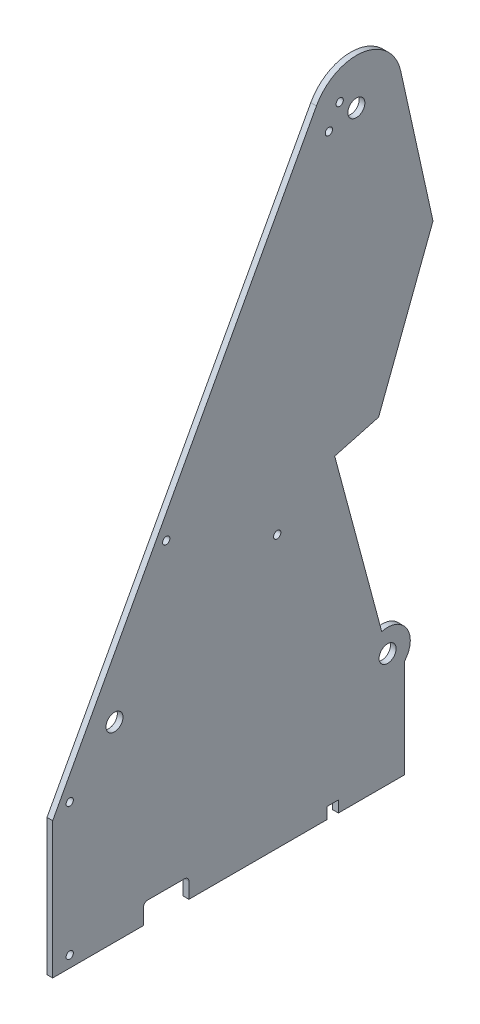
ISO-10303-21;
HEADER;
FILE_DESCRIPTION(('STEP AP214'),'2;1');
FILE_NAME('part.step','',(''),(''),'','','');
FILE_SCHEMA(('AUTOMOTIVE_DESIGN { 1 0 10303 214 1 1 1 1 }'));
ENDSEC;
DATA;
#1=APPLICATION_CONTEXT('core data for automotive mechanical design processes');
#2=APPLICATION_PROTOCOL_DEFINITION('international standard','automotive_design',2000,#1);
#3=PRODUCT_CONTEXT('',#1,'mechanical');
#4=PRODUCT('Part','Part','',(#3));
#5=PRODUCT_RELATED_PRODUCT_CATEGORY('part','',(#4));
#6=PRODUCT_DEFINITION_FORMATION('','',#4);
#7=PRODUCT_DEFINITION_CONTEXT('part definition',#1,'design');
#8=PRODUCT_DEFINITION('design','',#6,#7);
#9=PRODUCT_DEFINITION_SHAPE('','',#8);
#10=(LENGTH_UNIT() NAMED_UNIT(*) SI_UNIT(.MILLI.,.METRE.));
#11=(NAMED_UNIT(*) PLANE_ANGLE_UNIT() SI_UNIT($,.RADIAN.));
#12=(NAMED_UNIT(*) SI_UNIT($,.STERADIAN.) SOLID_ANGLE_UNIT());
#13=UNCERTAINTY_MEASURE_WITH_UNIT(LENGTH_MEASURE(1.E-05),#10,'distance_accuracy_value','');
#14=(GEOMETRIC_REPRESENTATION_CONTEXT(3) GLOBAL_UNCERTAINTY_ASSIGNED_CONTEXT((#13)) GLOBAL_UNIT_ASSIGNED_CONTEXT((#10,
#11,#12)) REPRESENTATION_CONTEXT('',''));
#15=CARTESIAN_POINT('',(0.,0.,0.));
#16=DIRECTION('',(0.,0.,1.));
#17=DIRECTION('',(1.,0.,0.));
#18=AXIS2_PLACEMENT_3D('',#15,#16,#17);
#19=CARTESIAN_POINT('',(3.175,0.,196.85));
#20=DIRECTION('',(0.,1.,0.));
#21=DIRECTION('',(0.,0.,1.));
#22=AXIS2_PLACEMENT_3D('',#19,#20,#21);
#23=PLANE('',#22);
#24=DIRECTION('',(0.,0.,-1.));
#25=VECTOR('',#24,1.);
#26=CARTESIAN_POINT('',(0.,0.,196.85));
#27=LINE('',#26,#25);
#28=CARTESIAN_POINT('',(0.,0.,120.65));
#29=VERTEX_POINT('',#28);
#30=CARTESIAN_POINT('',(0.,4.85722573273506E-13,43.4004223274925));
#31=VERTEX_POINT('',#30);
#32=EDGE_CURVE('E211',#29,#31,#27,.T.);
#33=ORIENTED_EDGE('',*,*,#32,.T.);
#34=DIRECTION('',(1.,0.,0.));
#35=VECTOR('',#34,1.);
#36=CARTESIAN_POINT('',(0.,4.85722573273506E-13,43.4004223274925));
#37=LINE('',#36,#35);
#38=CARTESIAN_POINT('',(3.175,4.85722573273506E-13,43.4004223274925));
#39=VERTEX_POINT('',#38);
#40=EDGE_CURVE('E212',#31,#39,#37,.T.);
#41=ORIENTED_EDGE('',*,*,#40,.T.);
#42=DIRECTION('',(0.,0.,-1.));
#43=VECTOR('',#42,1.);
#44=CARTESIAN_POINT('',(3.175,0.,196.85));
#45=LINE('',#44,#43);
#46=CARTESIAN_POINT('',(3.175,0.,120.65));
#47=VERTEX_POINT('',#46);
#48=EDGE_CURVE('E325',#47,#39,#45,.T.);
#49=ORIENTED_EDGE('',*,*,#48,.F.);
#50=DIRECTION('',(1.,0.,0.));
#51=VECTOR('',#50,1.);
#52=CARTESIAN_POINT('',(0.,0.,120.65));
#53=LINE('',#52,#51);
#54=EDGE_CURVE('E348',#29,#47,#53,.T.);
#55=ORIENTED_EDGE('',*,*,#54,.F.);
#56=EDGE_LOOP('',(#33,#41,#49,#55));
#57=FACE_BOUND('',#56,.T.);
#58=ADVANCED_FACE('F45',(#57),#23,.F.);
#59=CARTESIAN_POINT('',(3.175,4.85722573273506E-13,37.0504223274925));
#60=VERTEX_POINT('',#59);
#61=CARTESIAN_POINT('',(3.175,0.,0.));
#62=VERTEX_POINT('',#61);
#63=EDGE_CURVE('E205',#60,#62,#45,.T.);
#64=ORIENTED_EDGE('',*,*,#63,.F.);
#65=DIRECTION('',(1.,0.,0.));
#66=VECTOR('',#65,1.);
#67=CARTESIAN_POINT('',(0.,4.85722573273506E-13,37.0504223274925));
#68=LINE('',#67,#66);
#69=CARTESIAN_POINT('',(0.,4.85722573273506E-13,37.0504223274925));
#70=VERTEX_POINT('',#69);
#71=EDGE_CURVE('E192',#70,#60,#68,.T.);
#72=ORIENTED_EDGE('',*,*,#71,.F.);
#73=CARTESIAN_POINT('',(0.,0.,0.));
#74=VERTEX_POINT('',#73);
#75=EDGE_CURVE('E203',#70,#74,#27,.T.);
#76=ORIENTED_EDGE('',*,*,#75,.T.);
#77=DIRECTION('',(-1.,0.,0.));
#78=VECTOR('',#77,1.);
#79=CARTESIAN_POINT('',(3.175,0.,0.));
#80=LINE('',#79,#78);
#81=EDGE_CURVE('E11',#62,#74,#80,.T.);
#82=ORIENTED_EDGE('',*,*,#81,.F.);
#83=EDGE_LOOP('',(#64,#72,#76,#82));
#84=FACE_BOUND('',#83,.T.);
#85=ADVANCED_FACE('F201',(#84),#23,.F.);
#86=CARTESIAN_POINT('',(0.,0.,196.85));
#87=VERTEX_POINT('',#86);
#88=CARTESIAN_POINT('',(0.,0.,146.050000000102));
#89=VERTEX_POINT('',#88);
#90=EDGE_CURVE('E214',#87,#89,#27,.T.);
#91=ORIENTED_EDGE('',*,*,#90,.T.);
#92=DIRECTION('',(1.,0.,0.));
#93=VECTOR('',#92,1.);
#94=CARTESIAN_POINT('',(0.,0.,146.050000000102));
#95=LINE('',#94,#93);
#96=CARTESIAN_POINT('',(3.175,0.,146.050000000102));
#97=VERTEX_POINT('',#96);
#98=EDGE_CURVE('E68',#89,#97,#95,.T.);
#99=ORIENTED_EDGE('',*,*,#98,.T.);
#100=CARTESIAN_POINT('',(3.175,0.,196.85));
#101=VERTEX_POINT('',#100);
#102=EDGE_CURVE('E318',#101,#97,#45,.T.);
#103=ORIENTED_EDGE('',*,*,#102,.F.);
#104=DIRECTION('',(-1.,0.,0.));
#105=VECTOR('',#104,1.);
#106=CARTESIAN_POINT('',(3.175,0.,196.85));
#107=LINE('',#106,#105);
#108=EDGE_CURVE('E249',#101,#87,#107,.T.);
#109=ORIENTED_EDGE('',*,*,#108,.T.);
#110=EDGE_LOOP('',(#91,#99,#103,#109));
#111=FACE_BOUND('',#110,.T.);
#112=ADVANCED_FACE('F47',(#111),#23,.F.);
#113=CARTESIAN_POINT('',(3.175,0.,0.));
#114=DIRECTION('',(0.,0.,1.));
#115=DIRECTION('',(1.,0.,0.));
#116=AXIS2_PLACEMENT_3D('',#113,#114,#115);
#117=PLANE('',#116);
#118=DIRECTION('',(0.,1.,0.));
#119=VECTOR('',#118,1.);
#120=CARTESIAN_POINT('',(0.,0.,0.));
#121=LINE('',#120,#119);
#122=CARTESIAN_POINT('',(0.,55.0997395873699,0.));
#123=VERTEX_POINT('',#122);
#124=EDGE_CURVE('E210',#74,#123,#121,.T.);
#125=ORIENTED_EDGE('',*,*,#124,.T.);
#126=DIRECTION('',(-1.,0.,0.));
#127=VECTOR('',#126,1.);
#128=CARTESIAN_POINT('',(3.175,55.0997395873699,0.));
#129=LINE('',#128,#127);
#130=CARTESIAN_POINT('',(3.175,55.0997395873699,0.));
#131=VERTEX_POINT('',#130);
#132=EDGE_CURVE('E53',#131,#123,#129,.T.);
#133=ORIENTED_EDGE('',*,*,#132,.F.);
#134=DIRECTION('',(0.,1.,0.));
#135=VECTOR('',#134,1.);
#136=CARTESIAN_POINT('',(3.175,0.,0.));
#137=LINE('',#136,#135);
#138=EDGE_CURVE('E324',#62,#131,#137,.T.);
#139=ORIENTED_EDGE('',*,*,#138,.F.);
#140=ORIENTED_EDGE('',*,*,#81,.T.);
#141=EDGE_LOOP('',(#125,#133,#139,#140));
#142=FACE_BOUND('',#141,.T.);
#143=ADVANCED_FACE('F332',(#142),#117,.F.);
#144=CARTESIAN_POINT('',(3.175,63.5,9.52500000000001));
#145=DIRECTION('',(-1.,0.,0.));
#146=DIRECTION('',(0.,0.,1.));
#147=AXIS2_PLACEMENT_3D('',#144,#145,#146);
#148=CYLINDRICAL_SURFACE('',#147,12.7);
#149=CARTESIAN_POINT('',(0.,63.5,9.52500000000001));
#150=DIRECTION('',(1.,0.,0.));
#151=DIRECTION('',(0.,0.,-1.));
#152=AXIS2_PLACEMENT_3D('',#149,#150,#151);
#153=CIRCLE('',#152,12.7);
#154=CARTESIAN_POINT('',(0.,75.7672579938712,12.812001872802));
#155=VERTEX_POINT('',#154);
#156=EDGE_CURVE('E225',#123,#155,#153,.T.);
#157=ORIENTED_EDGE('',*,*,#156,.T.);
#158=DIRECTION('',(-1.,0.,0.));
#159=VECTOR('',#158,1.);
#160=CARTESIAN_POINT('',(3.175,75.7672579938712,12.812001872802));
#161=LINE('',#160,#159);
#162=CARTESIAN_POINT('',(3.175,75.7672579938712,12.812001872802));
#163=VERTEX_POINT('',#162);
#164=EDGE_CURVE('E273',#163,#155,#161,.T.);
#165=ORIENTED_EDGE('',*,*,#164,.F.);
#166=CARTESIAN_POINT('',(3.175,63.5,9.52500000000001));
#167=DIRECTION('',(1.,0.,0.));
#168=DIRECTION('',(0.,0.,-1.));
#169=AXIS2_PLACEMENT_3D('',#166,#167,#168);
#170=CIRCLE('',#169,12.7);
#171=EDGE_CURVE('E279',#131,#163,#170,.T.);
#172=ORIENTED_EDGE('',*,*,#171,.F.);
#173=ORIENTED_EDGE('',*,*,#132,.T.);
#174=EDGE_LOOP('',(#157,#165,#172,#173));
#175=FACE_BOUND('',#174,.T.);
#176=ADVANCED_FACE('F277',(#175),#148,.T.);
#177=CARTESIAN_POINT('',(3.175,173.905321944841,39.1080168552174));
#178=DIRECTION('',(0.,-0.258819045102515,0.96592582628907));
#179=DIRECTION('',(0.,-0.96592582628907,-0.258819045102515));
#180=AXIS2_PLACEMENT_3D('',#177,#178,#179);
#181=PLANE('',#180);
#182=DIRECTION('',(0.,0.96592582628907,0.258819045102515));
#183=VECTOR('',#182,1.);
#184=CARTESIAN_POINT('',(0.,173.905321944841,39.1080168552174));
#185=LINE('',#184,#183);
#186=CARTESIAN_POINT('',(0.,173.905321944841,39.1080168552174));
#187=VERTEX_POINT('',#186);
#188=EDGE_CURVE('E229',#155,#187,#185,.T.);
#189=ORIENTED_EDGE('',*,*,#188,.T.);
#190=DIRECTION('',(-1.,0.,0.));
#191=VECTOR('',#190,1.);
#192=CARTESIAN_POINT('',(3.175,173.905321944841,39.1080168552174));
#193=LINE('',#192,#191);
#194=CARTESIAN_POINT('',(3.175,173.905321944841,39.1080168552174));
#195=VERTEX_POINT('',#194);
#196=EDGE_CURVE('E270',#195,#187,#193,.T.);
#197=ORIENTED_EDGE('',*,*,#196,.F.);
#198=DIRECTION('',(0.,0.96592582628907,0.258819045102515));
#199=VECTOR('',#198,1.);
#200=CARTESIAN_POINT('',(3.175,173.905321944841,39.1080168552174));
#201=LINE('',#200,#199);
#202=EDGE_CURVE('E296',#163,#195,#201,.T.);
#203=ORIENTED_EDGE('',*,*,#202,.F.);
#204=ORIENTED_EDGE('',*,*,#164,.T.);
#205=EDGE_LOOP('',(#189,#197,#203,#204));
#206=FACE_BOUND('',#205,.T.);
#207=ADVANCED_FACE('F286',(#206),#181,.F.);
#208=CARTESIAN_POINT('',(3.175,173.905321944841,39.1080168552174));
#209=DIRECTION('',(0.,0.96592582628907,0.258819045102515));
#210=DIRECTION('',(0.,-0.258819045102515,0.96592582628907));
#211=AXIS2_PLACEMENT_3D('',#208,#209,#210);
#212=PLANE('',#211);
#213=DIRECTION('',(0.,0.258819045102515,-0.96592582628907));
#214=VECTOR('',#213,1.);
#215=CARTESIAN_POINT('',(0.,173.905321944841,39.1080168552174));
#216=LINE('',#215,#214);
#217=CARTESIAN_POINT('',(0.,180.479325690445,14.5735008674751));
#218=VERTEX_POINT('',#217);
#219=EDGE_CURVE('E233',#187,#218,#216,.T.);
#220=ORIENTED_EDGE('',*,*,#219,.T.);
#221=DIRECTION('',(-1.,0.,0.));
#222=VECTOR('',#221,1.);
#223=CARTESIAN_POINT('',(3.175,180.479325690445,14.5735008674751));
#224=LINE('',#223,#222);
#225=CARTESIAN_POINT('',(3.175,180.479325690445,14.5735008674751));
#226=VERTEX_POINT('',#225);
#227=EDGE_CURVE('E267',#226,#218,#224,.T.);
#228=ORIENTED_EDGE('',*,*,#227,.F.);
#229=DIRECTION('',(0.,0.258819045102515,-0.96592582628907));
#230=VECTOR('',#229,1.);
#231=CARTESIAN_POINT('',(3.175,173.905321944841,39.1080168552174));
#232=LINE('',#231,#230);
#233=EDGE_CURVE('E292',#195,#226,#232,.T.);
#234=ORIENTED_EDGE('',*,*,#233,.F.);
#235=ORIENTED_EDGE('',*,*,#196,.T.);
#236=EDGE_LOOP('',(#220,#228,#234,#235));
#237=FACE_BOUND('',#236,.T.);
#238=ADVANCED_FACE('F290',(#237),#212,.F.);
#239=CARTESIAN_POINT('',(3.175,180.479325690445,14.5735008674751));
#240=DIRECTION('',(0.,0.356215758470857,0.934403731487108));
#241=DIRECTION('',(0.,-0.934403731487108,0.356215758470857));
#242=AXIS2_PLACEMENT_3D('',#239,#240,#241);
#243=PLANE('',#242);
#244=DIRECTION('',(0.,0.934403731487108,-0.356215758470857));
#245=VECTOR('',#244,1.);
#246=CARTESIAN_POINT('',(0.,180.479325690445,14.5735008674751));
#247=LINE('',#246,#245);
#248=CARTESIAN_POINT('',(0.,260.35,-15.875));
#249=VERTEX_POINT('',#248);
#250=EDGE_CURVE('E235',#218,#249,#247,.T.);
#251=ORIENTED_EDGE('',*,*,#250,.T.);
#252=DIRECTION('',(-1.,0.,0.));
#253=VECTOR('',#252,1.);
#254=CARTESIAN_POINT('',(3.175,260.35,-15.875));
#255=LINE('',#254,#253);
#256=CARTESIAN_POINT('',(3.175,260.35,-15.875));
#257=VERTEX_POINT('',#256);
#258=EDGE_CURVE('E263',#257,#249,#255,.T.);
#259=ORIENTED_EDGE('',*,*,#258,.F.);
#260=DIRECTION('',(0.,0.934403731487108,-0.356215758470857));
#261=VECTOR('',#260,1.);
#262=CARTESIAN_POINT('',(3.175,180.479325690445,14.5735008674751));
#263=LINE('',#262,#261);
#264=EDGE_CURVE('E295',#226,#257,#263,.T.);
#265=ORIENTED_EDGE('',*,*,#264,.F.);
#266=ORIENTED_EDGE('',*,*,#227,.T.);
#267=EDGE_LOOP('',(#251,#259,#265,#266));
#268=FACE_BOUND('',#267,.T.);
#269=ADVANCED_FACE('F446',(#268),#243,.F.);
#270=CARTESIAN_POINT('',(3.175,260.35,-15.875));
#271=DIRECTION('',(0.,-0.215900332883476,0.976415406607661));
#272=DIRECTION('',(0.,-0.976415406607661,-0.215900332883476));
#273=AXIS2_PLACEMENT_3D('',#270,#271,#272);
#274=PLANE('',#273);
#275=DIRECTION('',(0.,0.976415406607661,0.215900332883476));
#276=VECTOR('',#275,1.);
#277=CARTESIAN_POINT('',(0.,260.35,-15.875));
#278=LINE('',#277,#276);
#279=CARTESIAN_POINT('',(0.,342.03386845524,2.18654867216544));
#280=VERTEX_POINT('',#279);
#281=EDGE_CURVE('E238',#249,#280,#278,.T.);
#282=ORIENTED_EDGE('',*,*,#281,.T.);
#283=DIRECTION('',(-1.,0.,0.));
#284=VECTOR('',#283,1.);
#285=CARTESIAN_POINT('',(3.175,342.03386845524,2.18654867216544));
#286=LINE('',#285,#284);
#287=CARTESIAN_POINT('',(3.175,342.03386845524,2.18654867216544));
#288=VERTEX_POINT('',#287);
#289=EDGE_CURVE('E259',#288,#280,#286,.T.);
#290=ORIENTED_EDGE('',*,*,#289,.F.);
#291=DIRECTION('',(0.,0.976415406607661,0.215900332883476));
#292=VECTOR('',#291,1.);
#293=CARTESIAN_POINT('',(3.175,260.35,-15.875));
#294=LINE('',#293,#292);
#295=EDGE_CURVE('E299',#257,#288,#294,.T.);
#296=ORIENTED_EDGE('',*,*,#295,.F.);
#297=ORIENTED_EDGE('',*,*,#258,.T.);
#298=EDGE_LOOP('',(#282,#290,#296,#297));
#299=FACE_BOUND('',#298,.T.);
#300=ADVANCED_FACE('F442',(#299),#274,.F.);
#301=CARTESIAN_POINT('',(3.175,336.55,26.9875));
#302=DIRECTION('',(-1.,0.,0.));
#303=DIRECTION('',(0.,0.,1.));
#304=AXIS2_PLACEMENT_3D('',#301,#302,#303);
#305=CYLINDRICAL_SURFACE('',#304,25.4);
#306=CARTESIAN_POINT('',(0.,336.55,26.9875));
#307=DIRECTION('',(1.,0.,0.));
#308=DIRECTION('',(0.,0.,-1.));
#309=AXIS2_PLACEMENT_3D('',#306,#307,#308);
#310=CIRCLE('',#309,25.4);
#311=CARTESIAN_POINT('',(0.,348.644594091572,49.3231395422229));
#312=VERTEX_POINT('',#311);
#313=EDGE_CURVE('E241',#280,#312,#310,.T.);
#314=ORIENTED_EDGE('',*,*,#313,.T.);
#315=DIRECTION('',(-1.,0.,0.));
#316=VECTOR('',#315,1.);
#317=CARTESIAN_POINT('',(3.175,348.644594091572,49.3231395422229));
#318=LINE('',#317,#316);
#319=CARTESIAN_POINT('',(3.175,348.644594091572,49.3231395422229));
#320=VERTEX_POINT('',#319);
#321=EDGE_CURVE('E255',#320,#312,#318,.T.);
#322=ORIENTED_EDGE('',*,*,#321,.F.);
#323=CARTESIAN_POINT('',(3.175,336.55,26.9875));
#324=DIRECTION('',(1.,0.,0.));
#325=DIRECTION('',(0.,0.,-1.));
#326=AXIS2_PLACEMENT_3D('',#323,#324,#325);
#327=CIRCLE('',#326,25.4);
#328=EDGE_CURVE('E306',#288,#320,#327,.T.);
#329=ORIENTED_EDGE('',*,*,#328,.F.);
#330=ORIENTED_EDGE('',*,*,#289,.T.);
#331=EDGE_LOOP('',(#314,#322,#329,#330));
#332=FACE_BOUND('',#331,.T.);
#333=ADVANCED_FACE('F438',(#332),#305,.T.);
#334=CARTESIAN_POINT('',(3.175,348.644594091572,49.3231395422229));
#335=DIRECTION('',(0.,-0.47616512171544,-0.879355887489087));
#336=DIRECTION('',(0.,0.879355887489087,-0.476165121715441));
#337=AXIS2_PLACEMENT_3D('',#334,#335,#336);
#338=PLANE('',#337);
#339=DIRECTION('',(0.,-0.879355887489087,0.476165121715441));
#340=VECTOR('',#339,1.);
#341=CARTESIAN_POINT('',(0.,348.644594091572,49.3231395422229));
#342=LINE('',#341,#340);
#343=CARTESIAN_POINT('',(0.,76.2,196.85));
#344=VERTEX_POINT('',#343);
#345=EDGE_CURVE('E244',#312,#344,#342,.T.);
#346=ORIENTED_EDGE('',*,*,#345,.T.);
#347=DIRECTION('',(-1.,0.,0.));
#348=VECTOR('',#347,1.);
#349=CARTESIAN_POINT('',(3.175,76.2,196.85));
#350=LINE('',#349,#348);
#351=CARTESIAN_POINT('',(3.175,76.2,196.85));
#352=VERTEX_POINT('',#351);
#353=EDGE_CURVE('E251',#352,#344,#350,.T.);
#354=ORIENTED_EDGE('',*,*,#353,.F.);
#355=DIRECTION('',(0.,-0.879355887489087,0.476165121715441));
#356=VECTOR('',#355,1.);
#357=CARTESIAN_POINT('',(3.175,348.644594091572,49.3231395422229));
#358=LINE('',#357,#356);
#359=EDGE_CURVE('E309',#320,#352,#358,.T.);
#360=ORIENTED_EDGE('',*,*,#359,.F.);
#361=ORIENTED_EDGE('',*,*,#321,.T.);
#362=EDGE_LOOP('',(#346,#354,#360,#361));
#363=FACE_BOUND('',#362,.T.);
#364=ADVANCED_FACE('F435',(#363),#338,.F.);
#365=CARTESIAN_POINT('',(3.175,76.2,196.85));
#366=DIRECTION('',(0.,0.,-1.));
#367=DIRECTION('',(-1.,0.,0.));
#368=AXIS2_PLACEMENT_3D('',#365,#366,#367);
#369=PLANE('',#368);
#370=DIRECTION('',(0.,-1.,0.));
#371=VECTOR('',#370,1.);
#372=CARTESIAN_POINT('',(0.,76.2,196.85));
#373=LINE('',#372,#371);
#374=EDGE_CURVE('E247',#344,#87,#373,.T.);
#375=ORIENTED_EDGE('',*,*,#374,.T.);
#376=ORIENTED_EDGE('',*,*,#108,.F.);
#377=DIRECTION('',(0.,-1.,0.));
#378=VECTOR('',#377,1.);
#379=CARTESIAN_POINT('',(3.175,76.2,196.85));
#380=LINE('',#379,#378);
#381=EDGE_CURVE('E252',#352,#101,#380,.T.);
#382=ORIENTED_EDGE('',*,*,#381,.F.);
#383=ORIENTED_EDGE('',*,*,#353,.T.);
#384=EDGE_LOOP('',(#375,#376,#382,#383));
#385=FACE_BOUND('',#384,.T.);
#386=ADVANCED_FACE('F322',(#385),#369,.F.);
#387=CARTESIAN_POINT('',(3.175,63.5,9.52500000000001));
#388=DIRECTION('',(1.,0.,0.));
#389=DIRECTION('',(0.,0.,-1.));
#390=AXIS2_PLACEMENT_3D('',#387,#388,#389);
#391=PLANE('',#390);
#392=CARTESIAN_POINT('',(3.175,180.132641427551,133.35));
#393=DIRECTION('',(1.,0.,0.));
#394=DIRECTION('',(0.,0.,-1.));
#395=AXIS2_PLACEMENT_3D('',#392,#393,#394);
#396=CIRCLE('',#395,2.032);
#397=CARTESIAN_POINT('',(3.175,180.132641427551,131.318));
#398=VERTEX_POINT('',#397);
#399=EDGE_CURVE('E662',#398,#398,#396,.T.);
#400=ORIENTED_EDGE('',*,*,#399,.F.);
#401=EDGE_LOOP('',(#400));
#402=FACE_BOUND('',#401,.T.);
#403=CARTESIAN_POINT('',(3.175,343.988077456522,36.3190426203798));
#404=DIRECTION('',(-1.,0.,0.));
#405=DIRECTION('',(0.,0.,1.));
#406=AXIS2_PLACEMENT_3D('',#403,#404,#405);
#407=CIRCLE('',#406,2.03200000000006);
#408=CARTESIAN_POINT('',(3.175,343.988077456522,38.3510426203799));
#409=VERTEX_POINT('',#408);
#410=EDGE_CURVE('E670',#409,#409,#407,.T.);
#411=ORIENTED_EDGE('',*,*,#410,.T.);
#412=EDGE_LOOP('',(#411));
#413=FACE_BOUND('',#412,.T.);
#414=CARTESIAN_POINT('',(3.175,332.820257685411,42.3663396661659));
#415=DIRECTION('',(-1.,0.,0.));
#416=DIRECTION('',(0.,0.,1.));
#417=AXIS2_PLACEMENT_3D('',#414,#415,#416);
#418=CIRCLE('',#417,2.03200000000005);
#419=CARTESIAN_POINT('',(3.175,332.820257685411,44.398339666166));
#420=VERTEX_POINT('',#419);
#421=EDGE_CURVE('E667',#420,#420,#418,.T.);
#422=ORIENTED_EDGE('',*,*,#421,.T.);
#423=EDGE_LOOP('',(#422));
#424=FACE_BOUND('',#423,.T.);
#425=CARTESIAN_POINT('',(3.175,80.4545426700619,187.325));
#426=DIRECTION('',(1.,0.,0.));
#427=DIRECTION('',(0.,0.,-1.));
#428=AXIS2_PLACEMENT_3D('',#425,#426,#427);
#429=CIRCLE('',#428,2.03200000000001);
#430=CARTESIAN_POINT('',(3.175,80.4545426700619,185.293));
#431=VERTEX_POINT('',#430);
#432=EDGE_CURVE('E690',#431,#431,#429,.T.);
#433=ORIENTED_EDGE('',*,*,#432,.F.);
#434=EDGE_LOOP('',(#433));
#435=FACE_BOUND('',#434,.T.);
#436=CARTESIAN_POINT('',(3.175,6.35,187.325));
#437=DIRECTION('',(1.,0.,0.));
#438=DIRECTION('',(0.,0.,-1.));
#439=AXIS2_PLACEMENT_3D('',#436,#437,#438);
#440=CIRCLE('',#439,2.03200000000001);
#441=CARTESIAN_POINT('',(3.175,6.35,185.293));
#442=VERTEX_POINT('',#441);
#443=EDGE_CURVE('E693',#442,#442,#440,.T.);
#444=ORIENTED_EDGE('',*,*,#443,.F.);
#445=EDGE_LOOP('',(#444));
#446=FACE_BOUND('',#445,.T.);
#447=CARTESIAN_POINT('',(3.175,151.942863157775,71.2566455378566));
#448=DIRECTION('',(1.,0.,0.));
#449=DIRECTION('',(0.,0.,-1.));
#450=AXIS2_PLACEMENT_3D('',#447,#448,#449);
#451=CIRCLE('',#450,2.03199999999999);
#452=CARTESIAN_POINT('',(3.175,151.942863157775,69.2246455378566));
#453=VERTEX_POINT('',#452);
#454=EDGE_CURVE('E689',#453,#453,#451,.T.);
#455=ORIENTED_EDGE('',*,*,#454,.F.);
#456=EDGE_LOOP('',(#455));
#457=FACE_BOUND('',#456,.T.);
#458=CARTESIAN_POINT('',(3.175,106.710874330434,162.275586361844));
#459=DIRECTION('',(1.,0.,0.));
#460=DIRECTION('',(0.,0.,-1.));
#461=AXIS2_PLACEMENT_3D('',#458,#459,#460);
#462=CIRCLE('',#461,4.76250000000001);
#463=CARTESIAN_POINT('',(3.175,106.710874330434,157.513086361844));
#464=VERTEX_POINT('',#463);
#465=EDGE_CURVE('E701',#464,#464,#462,.T.);
#466=ORIENTED_EDGE('',*,*,#465,.F.);
#467=EDGE_LOOP('',(#466));
#468=FACE_BOUND('',#467,.T.);
#469=CARTESIAN_POINT('',(3.175,336.55,26.9875));
#470=DIRECTION('',(1.,0.,0.));
#471=DIRECTION('',(0.,0.,-1.));
#472=AXIS2_PLACEMENT_3D('',#469,#470,#471);
#473=CIRCLE('',#472,4.7625);
#474=CARTESIAN_POINT('',(3.175,336.55,22.225));
#475=VERTEX_POINT('',#474);
#476=EDGE_CURVE('E707',#475,#475,#473,.T.);
#477=ORIENTED_EDGE('',*,*,#476,.F.);
#478=EDGE_LOOP('',(#477));
#479=FACE_BOUND('',#478,.T.);
#480=CARTESIAN_POINT('',(3.175,63.5,9.52500000000001));
#481=DIRECTION('',(1.,0.,0.));
#482=DIRECTION('',(0.,0.,-1.));
#483=AXIS2_PLACEMENT_3D('',#480,#481,#482);
#484=CIRCLE('',#483,4.76249999999999);
#485=CARTESIAN_POINT('',(3.175,63.5,4.76250000000002));
#486=VERTEX_POINT('',#485);
#487=EDGE_CURVE('E716',#486,#486,#484,.T.);
#488=ORIENTED_EDGE('',*,*,#487,.F.);
#489=EDGE_LOOP('',(#488));
#490=FACE_BOUND('',#489,.T.);
#491=DIRECTION('',(0.,-1.,0.));
#492=VECTOR('',#491,1.);
#493=CARTESIAN_POINT('',(3.175,6.35000000000049,43.4004223274925));
#494=LINE('',#493,#492);
#495=CARTESIAN_POINT('',(3.175,6.35000000000049,43.4004223274925));
#496=VERTEX_POINT('',#495);
#497=EDGE_CURVE('E197',#496,#39,#494,.T.);
#498=ORIENTED_EDGE('',*,*,#497,.F.);
#499=DIRECTION('',(0.,0.,1.));
#500=VECTOR('',#499,1.);
#501=CARTESIAN_POINT('',(3.175,6.35000000000049,37.0504223274925));
#502=LINE('',#501,#500);
#503=CARTESIAN_POINT('',(3.175,6.35000000000049,37.0504223274925));
#504=VERTEX_POINT('',#503);
#505=EDGE_CURVE('E359',#504,#496,#502,.T.);
#506=ORIENTED_EDGE('',*,*,#505,.F.);
#507=DIRECTION('',(0.,1.,0.));
#508=VECTOR('',#507,1.);
#509=CARTESIAN_POINT('',(3.175,4.85722573273506E-13,37.0504223274925));
#510=LINE('',#509,#508);
#511=EDGE_CURVE('E331',#60,#504,#510,.T.);
#512=ORIENTED_EDGE('',*,*,#511,.F.);
#513=ORIENTED_EDGE('',*,*,#63,.T.);
#514=ORIENTED_EDGE('',*,*,#138,.T.);
#515=ORIENTED_EDGE('',*,*,#171,.T.);
#516=ORIENTED_EDGE('',*,*,#202,.T.);
#517=ORIENTED_EDGE('',*,*,#233,.T.);
#518=ORIENTED_EDGE('',*,*,#264,.T.);
#519=ORIENTED_EDGE('',*,*,#295,.T.);
#520=ORIENTED_EDGE('',*,*,#328,.T.);
#521=ORIENTED_EDGE('',*,*,#359,.T.);
#522=ORIENTED_EDGE('',*,*,#381,.T.);
#523=ORIENTED_EDGE('',*,*,#102,.T.);
#524=DIRECTION('',(0.,-1.,0.));
#525=VECTOR('',#524,1.);
#526=CARTESIAN_POINT('',(3.175,8.79093139376589,146.050000000102));
#527=LINE('',#526,#525);
#528=CARTESIAN_POINT('',(3.175,8.79093139376589,146.050000000102));
#529=VERTEX_POINT('',#528);
#530=EDGE_CURVE('E388',#529,#97,#527,.T.);
#531=ORIENTED_EDGE('',*,*,#530,.F.);
#532=CARTESIAN_POINT('',(3.175,8.79093139376589,143.662400000034));
#533=DIRECTION('',(1.,0.,0.));
#534=DIRECTION('',(0.,0.,-1.));
#535=AXIS2_PLACEMENT_3D('',#532,#533,#534);
#536=CIRCLE('',#535,2.38760000006738);
#537=CARTESIAN_POINT('',(3.175,11.1785313938333,143.662400000034));
#538=VERTEX_POINT('',#537);
#539=EDGE_CURVE('E360',#538,#529,#536,.T.);
#540=ORIENTED_EDGE('',*,*,#539,.F.);
#541=DIRECTION('',(0.,0.,1.));
#542=VECTOR('',#541,1.);
#543=CARTESIAN_POINT('',(3.175,11.1785313938333,123.037600000067));
#544=LINE('',#543,#542);
#545=CARTESIAN_POINT('',(3.175,11.1785313938333,123.037600000067));
#546=VERTEX_POINT('',#545);
#547=EDGE_CURVE('E378',#546,#538,#544,.T.);
#548=ORIENTED_EDGE('',*,*,#547,.F.);
#549=CARTESIAN_POINT('',(3.175,8.79093139376589,123.037600000067));
#550=DIRECTION('',(1.,0.,0.));
#551=DIRECTION('',(0.,0.,-1.));
#552=AXIS2_PLACEMENT_3D('',#549,#550,#551);
#553=CIRCLE('',#552,2.38760000006738);
#554=CARTESIAN_POINT('',(3.175,8.7909313937659,120.65));
#555=VERTEX_POINT('',#554);
#556=EDGE_CURVE('E381',#555,#546,#553,.T.);
#557=ORIENTED_EDGE('',*,*,#556,.F.);
#558=DIRECTION('',(0.,1.,0.));
#559=VECTOR('',#558,1.);
#560=CARTESIAN_POINT('',(3.175,0.,120.65));
#561=LINE('',#560,#559);
#562=EDGE_CURVE('E385',#47,#555,#561,.T.);
#563=ORIENTED_EDGE('',*,*,#562,.F.);
#564=ORIENTED_EDGE('',*,*,#48,.T.);
#565=EDGE_LOOP('',(#498,#506,#512,#513,#514,#515,#516,#517,#518,#519,#520,#521,#522,#523,#531,
#540,#548,#557,#563,#564));
#566=FACE_BOUND('',#565,.T.);
#567=ADVANCED_FACE('F315',(#402,#413,#424,#435,#446,#457,#468,#479,#490,#566),#391,.T.);
#568=CARTESIAN_POINT('',(0.,63.5,9.52500000000001));
#569=DIRECTION('',(1.,0.,0.));
#570=DIRECTION('',(0.,0.,-1.));
#571=AXIS2_PLACEMENT_3D('',#568,#569,#570);
#572=PLANE('',#571);
#573=CARTESIAN_POINT('',(0.,180.132641427551,133.35));
#574=DIRECTION('',(1.,0.,0.));
#575=DIRECTION('',(0.,0.,-1.));
#576=AXIS2_PLACEMENT_3D('',#573,#574,#575);
#577=CIRCLE('',#576,2.032);
#578=CARTESIAN_POINT('',(0.,180.132641427551,131.318));
#579=VERTEX_POINT('',#578);
#580=EDGE_CURVE('E659',#579,#579,#577,.T.);
#581=ORIENTED_EDGE('',*,*,#580,.T.);
#582=EDGE_LOOP('',(#581));
#583=FACE_BOUND('',#582,.T.);
#584=CARTESIAN_POINT('',(0.,343.988077456522,36.3190426203798));
#585=DIRECTION('',(-1.,0.,0.));
#586=DIRECTION('',(0.,0.,1.));
#587=AXIS2_PLACEMENT_3D('',#584,#585,#586);
#588=CIRCLE('',#587,2.03200000000006);
#589=CARTESIAN_POINT('',(0.,343.988077456522,38.3510426203799));
#590=VERTEX_POINT('',#589);
#591=EDGE_CURVE('E675',#590,#590,#588,.T.);
#592=ORIENTED_EDGE('',*,*,#591,.F.);
#593=EDGE_LOOP('',(#592));
#594=FACE_BOUND('',#593,.T.);
#595=CARTESIAN_POINT('',(0.,332.820257685411,42.3663396661659));
#596=DIRECTION('',(-1.,0.,0.));
#597=DIRECTION('',(0.,0.,1.));
#598=AXIS2_PLACEMENT_3D('',#595,#596,#597);
#599=CIRCLE('',#598,2.03200000000005);
#600=CARTESIAN_POINT('',(0.,332.820257685411,44.398339666166));
#601=VERTEX_POINT('',#600);
#602=EDGE_CURVE('E679',#601,#601,#599,.T.);
#603=ORIENTED_EDGE('',*,*,#602,.F.);
#604=EDGE_LOOP('',(#603));
#605=FACE_BOUND('',#604,.T.);
#606=CARTESIAN_POINT('',(0.,80.4545426700619,187.325));
#607=DIRECTION('',(1.,0.,0.));
#608=DIRECTION('',(0.,0.,-1.));
#609=AXIS2_PLACEMENT_3D('',#606,#607,#608);
#610=CIRCLE('',#609,2.03200000000001);
#611=CARTESIAN_POINT('',(0.,80.4545426700619,185.293));
#612=VERTEX_POINT('',#611);
#613=EDGE_CURVE('E686',#612,#612,#610,.T.);
#614=ORIENTED_EDGE('',*,*,#613,.T.);
#615=EDGE_LOOP('',(#614));
#616=FACE_BOUND('',#615,.T.);
#617=CARTESIAN_POINT('',(0.,6.35,187.325));
#618=DIRECTION('',(1.,0.,0.));
#619=DIRECTION('',(0.,0.,-1.));
#620=AXIS2_PLACEMENT_3D('',#617,#618,#619);
#621=CIRCLE('',#620,2.03200000000001);
#622=CARTESIAN_POINT('',(0.,6.35,185.293));
#623=VERTEX_POINT('',#622);
#624=EDGE_CURVE('E674',#623,#623,#621,.T.);
#625=ORIENTED_EDGE('',*,*,#624,.T.);
#626=EDGE_LOOP('',(#625));
#627=FACE_BOUND('',#626,.T.);
#628=CARTESIAN_POINT('',(0.,151.942863157775,71.2566455378566));
#629=DIRECTION('',(1.,0.,0.));
#630=DIRECTION('',(0.,0.,-1.));
#631=AXIS2_PLACEMENT_3D('',#628,#629,#630);
#632=CIRCLE('',#631,2.03199999999999);
#633=CARTESIAN_POINT('',(0.,151.942863157775,69.2246455378566));
#634=VERTEX_POINT('',#633);
#635=EDGE_CURVE('E698',#634,#634,#632,.T.);
#636=ORIENTED_EDGE('',*,*,#635,.T.);
#637=EDGE_LOOP('',(#636));
#638=FACE_BOUND('',#637,.T.);
#639=CARTESIAN_POINT('',(0.,106.710874330434,162.275586361844));
#640=DIRECTION('',(1.,0.,0.));
#641=DIRECTION('',(0.,0.,-1.));
#642=AXIS2_PLACEMENT_3D('',#639,#640,#641);
#643=CIRCLE('',#642,4.76250000000001);
#644=CARTESIAN_POINT('',(0.,106.710874330434,157.513086361844));
#645=VERTEX_POINT('',#644);
#646=EDGE_CURVE('E704',#645,#645,#643,.T.);
#647=ORIENTED_EDGE('',*,*,#646,.T.);
#648=EDGE_LOOP('',(#647));
#649=FACE_BOUND('',#648,.T.);
#650=CARTESIAN_POINT('',(0.,336.55,26.9875));
#651=DIRECTION('',(1.,0.,0.));
#652=DIRECTION('',(0.,0.,-1.));
#653=AXIS2_PLACEMENT_3D('',#650,#651,#652);
#654=CIRCLE('',#653,4.7625);
#655=CARTESIAN_POINT('',(0.,336.55,22.225));
#656=VERTEX_POINT('',#655);
#657=EDGE_CURVE('E712',#656,#656,#654,.T.);
#658=ORIENTED_EDGE('',*,*,#657,.T.);
#659=EDGE_LOOP('',(#658));
#660=FACE_BOUND('',#659,.T.);
#661=CARTESIAN_POINT('',(0.,63.5,9.52500000000001));
#662=DIRECTION('',(1.,0.,0.));
#663=DIRECTION('',(0.,0.,-1.));
#664=AXIS2_PLACEMENT_3D('',#661,#662,#663);
#665=CIRCLE('',#664,4.7625);
#666=CARTESIAN_POINT('',(0.,63.5,4.76250000000001));
#667=VERTEX_POINT('',#666);
#668=EDGE_CURVE('E377',#667,#667,#665,.T.);
#669=ORIENTED_EDGE('',*,*,#668,.T.);
#670=EDGE_LOOP('',(#669));
#671=FACE_BOUND('',#670,.T.);
#672=DIRECTION('',(0.,0.,1.));
#673=VECTOR('',#672,1.);
#674=CARTESIAN_POINT('',(0.,6.35000000000049,37.0504223274925));
#675=LINE('',#674,#673);
#676=CARTESIAN_POINT('',(0.,6.35000000000048,37.0504223274925));
#677=VERTEX_POINT('',#676);
#678=CARTESIAN_POINT('',(0.,6.35000000000049,43.4004223274925));
#679=VERTEX_POINT('',#678);
#680=EDGE_CURVE('E60',#677,#679,#675,.T.);
#681=ORIENTED_EDGE('',*,*,#680,.T.);
#682=DIRECTION('',(0.,-1.,0.));
#683=VECTOR('',#682,1.);
#684=CARTESIAN_POINT('',(0.,6.35000000000049,43.4004223274925));
#685=LINE('',#684,#683);
#686=EDGE_CURVE('E206',#679,#31,#685,.T.);
#687=ORIENTED_EDGE('',*,*,#686,.T.);
#688=ORIENTED_EDGE('',*,*,#32,.F.);
#689=DIRECTION('',(0.,1.,0.));
#690=VECTOR('',#689,1.);
#691=CARTESIAN_POINT('',(0.,0.,120.65));
#692=LINE('',#691,#690);
#693=CARTESIAN_POINT('',(0.,8.7909313937659,120.65));
#694=VERTEX_POINT('',#693);
#695=EDGE_CURVE('E352',#29,#694,#692,.T.);
#696=ORIENTED_EDGE('',*,*,#695,.T.);
#697=CARTESIAN_POINT('',(0.,8.79093139376589,123.037600000067));
#698=DIRECTION('',(1.,0.,0.));
#699=DIRECTION('',(0.,0.,-1.));
#700=AXIS2_PLACEMENT_3D('',#697,#698,#699);
#701=CIRCLE('',#700,2.38760000006738);
#702=CARTESIAN_POINT('',(0.,11.1785313938333,123.037600000067));
#703=VERTEX_POINT('',#702);
#704=EDGE_CURVE('E394',#694,#703,#701,.T.);
#705=ORIENTED_EDGE('',*,*,#704,.T.);
#706=DIRECTION('',(0.,0.,1.));
#707=VECTOR('',#706,1.);
#708=CARTESIAN_POINT('',(0.,11.1785313938333,123.037600000067));
#709=LINE('',#708,#707);
#710=CARTESIAN_POINT('',(0.,11.1785313938333,143.662400000034));
#711=VERTEX_POINT('',#710);
#712=EDGE_CURVE('E368',#703,#711,#709,.T.);
#713=ORIENTED_EDGE('',*,*,#712,.T.);
#714=CARTESIAN_POINT('',(0.,8.79093139376589,143.662400000034));
#715=DIRECTION('',(1.,0.,0.));
#716=DIRECTION('',(0.,0.,-1.));
#717=AXIS2_PLACEMENT_3D('',#714,#715,#716);
#718=CIRCLE('',#717,2.38760000006738);
#719=CARTESIAN_POINT('',(0.,8.79093139376589,146.050000000102));
#720=VERTEX_POINT('',#719);
#721=EDGE_CURVE('E382',#711,#720,#718,.T.);
#722=ORIENTED_EDGE('',*,*,#721,.T.);
#723=DIRECTION('',(0.,-1.,0.));
#724=VECTOR('',#723,1.);
#725=CARTESIAN_POINT('',(0.,8.79093139376589,146.050000000102));
#726=LINE('',#725,#724);
#727=EDGE_CURVE('E397',#720,#89,#726,.T.);
#728=ORIENTED_EDGE('',*,*,#727,.T.);
#729=ORIENTED_EDGE('',*,*,#90,.F.);
#730=ORIENTED_EDGE('',*,*,#374,.F.);
#731=ORIENTED_EDGE('',*,*,#345,.F.);
#732=ORIENTED_EDGE('',*,*,#313,.F.);
#733=ORIENTED_EDGE('',*,*,#281,.F.);
#734=ORIENTED_EDGE('',*,*,#250,.F.);
#735=ORIENTED_EDGE('',*,*,#219,.F.);
#736=ORIENTED_EDGE('',*,*,#188,.F.);
#737=ORIENTED_EDGE('',*,*,#156,.F.);
#738=ORIENTED_EDGE('',*,*,#124,.F.);
#739=ORIENTED_EDGE('',*,*,#75,.F.);
#740=DIRECTION('',(0.,1.,0.));
#741=VECTOR('',#740,1.);
#742=CARTESIAN_POINT('',(0.,4.85722573273506E-13,37.0504223274925));
#743=LINE('',#742,#741);
#744=EDGE_CURVE('E188',#70,#677,#743,.T.);
#745=ORIENTED_EDGE('',*,*,#744,.T.);
#746=EDGE_LOOP('',(#681,#687,#688,#696,#705,#713,#722,#728,#729,#730,#731,#732,#733,#734,#735,
#736,#737,#738,#739,#745));
#747=FACE_BOUND('',#746,.T.);
#748=ADVANCED_FACE('F208',(#583,#594,#605,#616,#627,#638,#649,#660,#671,#747),#572,.F.);
#749=CARTESIAN_POINT('',(0.,8.79093139376589,143.662400000034));
#750=DIRECTION('',(1.,0.,0.));
#751=DIRECTION('',(0.,0.,-1.));
#752=AXIS2_PLACEMENT_3D('',#749,#750,#751);
#753=CYLINDRICAL_SURFACE('',#752,2.38760000006738);
#754=ORIENTED_EDGE('',*,*,#539,.T.);
#755=DIRECTION('',(1.,0.,0.));
#756=VECTOR('',#755,1.);
#757=CARTESIAN_POINT('',(0.,8.79093139376589,146.050000000102));
#758=LINE('',#757,#756);
#759=EDGE_CURVE('E366',#720,#529,#758,.T.);
#760=ORIENTED_EDGE('',*,*,#759,.F.);
#761=ORIENTED_EDGE('',*,*,#721,.F.);
#762=DIRECTION('',(1.,0.,0.));
#763=VECTOR('',#762,1.);
#764=CARTESIAN_POINT('',(0.,11.1785313938333,143.662400000034));
#765=LINE('',#764,#763);
#766=EDGE_CURVE('E375',#711,#538,#765,.T.);
#767=ORIENTED_EDGE('',*,*,#766,.T.);
#768=EDGE_LOOP('',(#754,#760,#761,#767));
#769=FACE_BOUND('',#768,.T.);
#770=ADVANCED_FACE('F402',(#769),#753,.F.);
#771=CARTESIAN_POINT('',(0.,11.1785313938333,123.037600000067));
#772=DIRECTION('',(0.,1.,0.));
#773=DIRECTION('',(0.,0.,1.));
#774=AXIS2_PLACEMENT_3D('',#771,#772,#773);
#775=PLANE('',#774);
#776=ORIENTED_EDGE('',*,*,#547,.T.);
#777=ORIENTED_EDGE('',*,*,#766,.F.);
#778=ORIENTED_EDGE('',*,*,#712,.F.);
#779=DIRECTION('',(1.,0.,0.));
#780=VECTOR('',#779,1.);
#781=CARTESIAN_POINT('',(0.,11.1785313938333,123.037600000067));
#782=LINE('',#781,#780);
#783=EDGE_CURVE('E373',#703,#546,#782,.T.);
#784=ORIENTED_EDGE('',*,*,#783,.T.);
#785=EDGE_LOOP('',(#776,#777,#778,#784));
#786=FACE_BOUND('',#785,.T.);
#787=ADVANCED_FACE('F423',(#786),#775,.F.);
#788=CARTESIAN_POINT('',(0.,8.79093139376589,123.037600000067));
#789=DIRECTION('',(1.,0.,0.));
#790=DIRECTION('',(0.,0.,-1.));
#791=AXIS2_PLACEMENT_3D('',#788,#789,#790);
#792=CYLINDRICAL_SURFACE('',#791,2.38760000006738);
#793=ORIENTED_EDGE('',*,*,#556,.T.);
#794=ORIENTED_EDGE('',*,*,#783,.F.);
#795=ORIENTED_EDGE('',*,*,#704,.F.);
#796=DIRECTION('',(1.,0.,0.));
#797=VECTOR('',#796,1.);
#798=CARTESIAN_POINT('',(0.,8.7909313937659,120.65));
#799=LINE('',#798,#797);
#800=EDGE_CURVE('E371',#694,#555,#799,.T.);
#801=ORIENTED_EDGE('',*,*,#800,.T.);
#802=EDGE_LOOP('',(#793,#794,#795,#801));
#803=FACE_BOUND('',#802,.T.);
#804=ADVANCED_FACE('F415',(#803),#792,.F.);
#805=CARTESIAN_POINT('',(0.,0.,120.65));
#806=DIRECTION('',(0.,0.,-1.));
#807=DIRECTION('',(0.,1.,0.));
#808=AXIS2_PLACEMENT_3D('',#805,#806,#807);
#809=PLANE('',#808);
#810=ORIENTED_EDGE('',*,*,#562,.T.);
#811=ORIENTED_EDGE('',*,*,#800,.F.);
#812=ORIENTED_EDGE('',*,*,#695,.F.);
#813=ORIENTED_EDGE('',*,*,#54,.T.);
#814=EDGE_LOOP('',(#810,#811,#812,#813));
#815=FACE_BOUND('',#814,.T.);
#816=ADVANCED_FACE('F407',(#815),#809,.F.);
#817=CARTESIAN_POINT('',(0.,8.79093139376589,146.050000000102));
#818=DIRECTION('',(0.,0.,1.));
#819=DIRECTION('',(0.,-1.,0.));
#820=AXIS2_PLACEMENT_3D('',#817,#818,#819);
#821=PLANE('',#820);
#822=ORIENTED_EDGE('',*,*,#530,.T.);
#823=ORIENTED_EDGE('',*,*,#98,.F.);
#824=ORIENTED_EDGE('',*,*,#727,.F.);
#825=ORIENTED_EDGE('',*,*,#759,.T.);
#826=EDGE_LOOP('',(#822,#823,#824,#825));
#827=FACE_BOUND('',#826,.T.);
#828=ADVANCED_FACE('F404',(#827),#821,.F.);
#829=CARTESIAN_POINT('',(0.,6.35000000000049,43.4004223274925));
#830=DIRECTION('',(0.,0.,1.));
#831=DIRECTION('',(1.,0.,0.));
#832=AXIS2_PLACEMENT_3D('',#829,#830,#831);
#833=PLANE('',#832);
#834=ORIENTED_EDGE('',*,*,#497,.T.);
#835=ORIENTED_EDGE('',*,*,#40,.F.);
#836=ORIENTED_EDGE('',*,*,#686,.F.);
#837=DIRECTION('',(1.,0.,0.));
#838=VECTOR('',#837,1.);
#839=CARTESIAN_POINT('',(0.,6.35000000000049,43.4004223274925));
#840=LINE('',#839,#838);
#841=EDGE_CURVE('E217',#679,#496,#840,.T.);
#842=ORIENTED_EDGE('',*,*,#841,.T.);
#843=EDGE_LOOP('',(#834,#835,#836,#842));
#844=FACE_BOUND('',#843,.T.);
#845=ADVANCED_FACE('F406',(#844),#833,.F.);
#846=CARTESIAN_POINT('',(0.,6.35000000000049,37.0504223274925));
#847=DIRECTION('',(0.,1.,0.));
#848=DIRECTION('',(0.,0.,1.));
#849=AXIS2_PLACEMENT_3D('',#846,#847,#848);
#850=PLANE('',#849);
#851=ORIENTED_EDGE('',*,*,#505,.T.);
#852=ORIENTED_EDGE('',*,*,#841,.F.);
#853=ORIENTED_EDGE('',*,*,#680,.F.);
#854=DIRECTION('',(1.,0.,0.));
#855=VECTOR('',#854,1.);
#856=CARTESIAN_POINT('',(0.,6.35000000000049,37.0504223274925));
#857=LINE('',#856,#855);
#858=EDGE_CURVE('E194',#677,#504,#857,.T.);
#859=ORIENTED_EDGE('',*,*,#858,.T.);
#860=EDGE_LOOP('',(#851,#852,#853,#859));
#861=FACE_BOUND('',#860,.T.);
#862=ADVANCED_FACE('F413',(#861),#850,.F.);
#863=CARTESIAN_POINT('',(0.,4.85722573273506E-13,37.0504223274925));
#864=DIRECTION('',(0.,0.,-1.));
#865=DIRECTION('',(-1.,0.,0.));
#866=AXIS2_PLACEMENT_3D('',#863,#864,#865);
#867=PLANE('',#866);
#868=ORIENTED_EDGE('',*,*,#511,.T.);
#869=ORIENTED_EDGE('',*,*,#858,.F.);
#870=ORIENTED_EDGE('',*,*,#744,.F.);
#871=ORIENTED_EDGE('',*,*,#71,.T.);
#872=EDGE_LOOP('',(#868,#869,#870,#871));
#873=FACE_BOUND('',#872,.T.);
#874=ADVANCED_FACE('F191',(#873),#867,.F.);
#875=CARTESIAN_POINT('',(3.175,63.5,9.52500000000001));
#876=DIRECTION('',(1.,0.,0.));
#877=DIRECTION('',(0.,0.,-1.));
#878=AXIS2_PLACEMENT_3D('',#875,#876,#877);
#879=CYLINDRICAL_SURFACE('',#878,4.7625);
#880=ORIENTED_EDGE('',*,*,#668,.F.);
#881=EDGE_LOOP('',(#880));
#882=FACE_BOUND('',#881,.T.);
#883=ORIENTED_EDGE('',*,*,#487,.T.);
#884=EDGE_LOOP('',(#883));
#885=FACE_BOUND('',#884,.T.);
#886=ADVANCED_FACE('F567',(#882,#885),#879,.F.);
#887=CARTESIAN_POINT('',(3.175,336.55,26.9875));
#888=DIRECTION('',(1.,0.,0.));
#889=DIRECTION('',(0.,0.,-1.));
#890=AXIS2_PLACEMENT_3D('',#887,#888,#889);
#891=CYLINDRICAL_SURFACE('',#890,4.7625);
#892=ORIENTED_EDGE('',*,*,#657,.F.);
#893=EDGE_LOOP('',(#892));
#894=FACE_BOUND('',#893,.T.);
#895=ORIENTED_EDGE('',*,*,#476,.T.);
#896=EDGE_LOOP('',(#895));
#897=FACE_BOUND('',#896,.T.);
#898=ADVANCED_FACE('F575',(#894,#897),#891,.F.);
#899=CARTESIAN_POINT('',(0.,106.710874330434,162.275586361844));
#900=DIRECTION('',(1.,0.,0.));
#901=DIRECTION('',(0.,0.,-1.));
#902=AXIS2_PLACEMENT_3D('',#899,#900,#901);
#903=CYLINDRICAL_SURFACE('',#902,4.76250000000001);
#904=ORIENTED_EDGE('',*,*,#646,.F.);
#905=EDGE_LOOP('',(#904));
#906=FACE_BOUND('',#905,.T.);
#907=ORIENTED_EDGE('',*,*,#465,.T.);
#908=EDGE_LOOP('',(#907));
#909=FACE_BOUND('',#908,.T.);
#910=ADVANCED_FACE('F585',(#906,#909),#903,.F.);
#911=CARTESIAN_POINT('',(0.,151.942863157775,71.2566455378566));
#912=DIRECTION('',(1.,0.,0.));
#913=DIRECTION('',(0.,0.,-1.));
#914=AXIS2_PLACEMENT_3D('',#911,#912,#913);
#915=CYLINDRICAL_SURFACE('',#914,2.03199999999999);
#916=ORIENTED_EDGE('',*,*,#635,.F.);
#917=EDGE_LOOP('',(#916));
#918=FACE_BOUND('',#917,.T.);
#919=ORIENTED_EDGE('',*,*,#454,.T.);
#920=EDGE_LOOP('',(#919));
#921=FACE_BOUND('',#920,.T.);
#922=ADVANCED_FACE('F595',(#918,#921),#915,.F.);
#923=CARTESIAN_POINT('',(0.,6.35,187.325));
#924=DIRECTION('',(1.,0.,0.));
#925=DIRECTION('',(0.,0.,-1.));
#926=AXIS2_PLACEMENT_3D('',#923,#924,#925);
#927=CYLINDRICAL_SURFACE('',#926,2.03200000000001);
#928=ORIENTED_EDGE('',*,*,#624,.F.);
#929=EDGE_LOOP('',(#928));
#930=FACE_BOUND('',#929,.T.);
#931=ORIENTED_EDGE('',*,*,#443,.T.);
#932=EDGE_LOOP('',(#931));
#933=FACE_BOUND('',#932,.T.);
#934=ADVANCED_FACE('F605',(#930,#933),#927,.F.);
#935=CARTESIAN_POINT('',(0.,80.4545426700619,187.325));
#936=DIRECTION('',(1.,0.,0.));
#937=DIRECTION('',(0.,0.,-1.));
#938=AXIS2_PLACEMENT_3D('',#935,#936,#937);
#939=CYLINDRICAL_SURFACE('',#938,2.03200000000001);
#940=ORIENTED_EDGE('',*,*,#613,.F.);
#941=EDGE_LOOP('',(#940));
#942=FACE_BOUND('',#941,.T.);
#943=ORIENTED_EDGE('',*,*,#432,.T.);
#944=EDGE_LOOP('',(#943));
#945=FACE_BOUND('',#944,.T.);
#946=ADVANCED_FACE('F615',(#942,#945),#939,.F.);
#947=CARTESIAN_POINT('',(3.175,332.820257685411,42.3663396661659));
#948=DIRECTION('',(-1.,0.,0.));
#949=DIRECTION('',(0.,0.,1.));
#950=AXIS2_PLACEMENT_3D('',#947,#948,#949);
#951=CYLINDRICAL_SURFACE('',#950,2.03200000000005);
#952=ORIENTED_EDGE('',*,*,#421,.F.);
#953=EDGE_LOOP('',(#952));
#954=FACE_BOUND('',#953,.T.);
#955=ORIENTED_EDGE('',*,*,#602,.T.);
#956=EDGE_LOOP('',(#955));
#957=FACE_BOUND('',#956,.T.);
#958=ADVANCED_FACE('F625',(#954,#957),#951,.F.);
#959=CARTESIAN_POINT('',(3.175,343.988077456522,36.3190426203798));
#960=DIRECTION('',(-1.,0.,0.));
#961=DIRECTION('',(0.,0.,1.));
#962=AXIS2_PLACEMENT_3D('',#959,#960,#961);
#963=CYLINDRICAL_SURFACE('',#962,2.03200000000006);
#964=ORIENTED_EDGE('',*,*,#410,.F.);
#965=EDGE_LOOP('',(#964));
#966=FACE_BOUND('',#965,.T.);
#967=ORIENTED_EDGE('',*,*,#591,.T.);
#968=EDGE_LOOP('',(#967));
#969=FACE_BOUND('',#968,.T.);
#970=ADVANCED_FACE('F635',(#966,#969),#963,.F.);
#971=CARTESIAN_POINT('',(0.,180.132641427551,133.35));
#972=DIRECTION('',(1.,0.,0.));
#973=DIRECTION('',(0.,0.,-1.));
#974=AXIS2_PLACEMENT_3D('',#971,#972,#973);
#975=CYLINDRICAL_SURFACE('',#974,2.032);
#976=ORIENTED_EDGE('',*,*,#580,.F.);
#977=EDGE_LOOP('',(#976));
#978=FACE_BOUND('',#977,.T.);
#979=ORIENTED_EDGE('',*,*,#399,.T.);
#980=EDGE_LOOP('',(#979));
#981=FACE_BOUND('',#980,.T.);
#982=ADVANCED_FACE('F644',(#978,#981),#975,.F.);
#983=CLOSED_SHELL('',(#58,#85,#112,#143,#176,#207,#238,#269,#300,#333,#364,#386,#567,#748,#770,
#787,#804,#816,#828,#845,#862,#874,#886,#898,#910,#922,#934,#946,#958,#970,#982));
#984=MANIFOLD_SOLID_BREP('B2',#983);
#985=ADVANCED_BREP_SHAPE_REPRESENTATION('',(#18,#984),#14);
#986=SHAPE_DEFINITION_REPRESENTATION(#9,#985);
ENDSEC;
END-ISO-10303-21;
